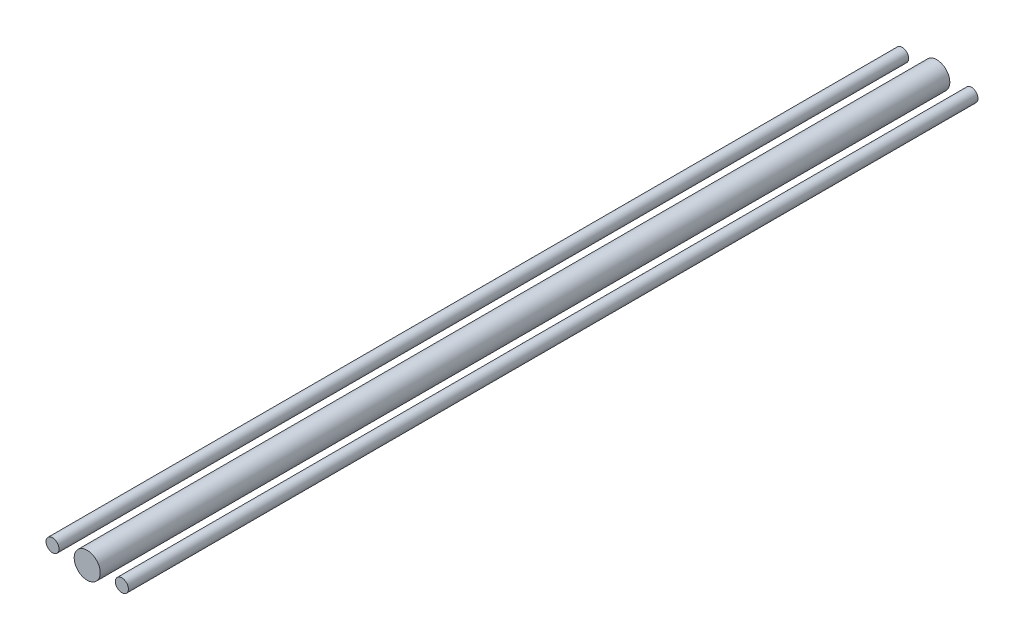
ISO-10303-21;
HEADER;
FILE_DESCRIPTION(('STEP AP214'),'2;1');
FILE_NAME('part.step','',(''),(''),'','','');
FILE_SCHEMA(('AUTOMOTIVE_DESIGN { 1 0 10303 214 1 1 1 1 }'));
ENDSEC;
DATA;
#1=APPLICATION_CONTEXT('core data for automotive mechanical design processes');
#2=APPLICATION_PROTOCOL_DEFINITION('international standard','automotive_design',2000,#1);
#3=PRODUCT_CONTEXT('',#1,'mechanical');
#4=PRODUCT('Part','Part','',(#3));
#5=PRODUCT_RELATED_PRODUCT_CATEGORY('part','',(#4));
#6=PRODUCT_DEFINITION_FORMATION('','',#4);
#7=PRODUCT_DEFINITION_CONTEXT('part definition',#1,'design');
#8=PRODUCT_DEFINITION('design','',#6,#7);
#9=PRODUCT_DEFINITION_SHAPE('','',#8);
#10=(LENGTH_UNIT() NAMED_UNIT(*) SI_UNIT(.MILLI.,.METRE.));
#11=(NAMED_UNIT(*) PLANE_ANGLE_UNIT() SI_UNIT($,.RADIAN.));
#12=(NAMED_UNIT(*) SI_UNIT($,.STERADIAN.) SOLID_ANGLE_UNIT());
#13=UNCERTAINTY_MEASURE_WITH_UNIT(LENGTH_MEASURE(1.E-05),#10,'distance_accuracy_value','');
#14=(GEOMETRIC_REPRESENTATION_CONTEXT(3) GLOBAL_UNCERTAINTY_ASSIGNED_CONTEXT((#13)) GLOBAL_UNIT_ASSIGNED_CONTEXT((#10,
#11,#12)) REPRESENTATION_CONTEXT('',''));
#15=CARTESIAN_POINT('',(0.,0.,0.));
#16=DIRECTION('',(0.,0.,1.));
#17=DIRECTION('',(1.,0.,0.));
#18=AXIS2_PLACEMENT_3D('',#15,#16,#17);
#19=CARTESIAN_POINT('',(-40.,0.,1000.));
#20=DIRECTION('',(0.,0.,-1.));
#21=DIRECTION('',(-1.,0.,0.));
#22=AXIS2_PLACEMENT_3D('',#19,#20,#21);
#23=CYLINDRICAL_SURFACE('',#22,7.5);
#24=CARTESIAN_POINT('',(-40.,0.,19.9999999999999));
#25=DIRECTION('',(0.,0.,1.));
#26=DIRECTION('',(1.,0.,0.));
#27=AXIS2_PLACEMENT_3D('',#24,#25,#26);
#28=CIRCLE('',#27,7.5);
#29=CARTESIAN_POINT('',(-32.5,0.,19.9999999999999));
#30=VERTEX_POINT('',#29);
#31=EDGE_CURVE('E51',#30,#30,#28,.F.);
#32=ORIENTED_EDGE('',*,*,#31,.F.);
#33=EDGE_LOOP('',(#32));
#34=FACE_BOUND('',#33,.T.);
#35=CARTESIAN_POINT('',(-40.,0.,1000.));
#36=DIRECTION('',(0.,0.,-1.));
#37=DIRECTION('',(-1.,0.,0.));
#38=AXIS2_PLACEMENT_3D('',#35,#36,#37);
#39=CIRCLE('',#38,7.5);
#40=CARTESIAN_POINT('',(-47.5,0.,1000.));
#41=VERTEX_POINT('',#40);
#42=EDGE_CURVE('E11',#41,#41,#39,.T.);
#43=ORIENTED_EDGE('',*,*,#42,.T.);
#44=EDGE_LOOP('',(#43));
#45=FACE_BOUND('',#44,.T.);
#46=ADVANCED_FACE('F47',(#34,#45),#23,.T.);
#47=CARTESIAN_POINT('',(-40.,0.,1000.));
#48=DIRECTION('',(0.,0.,-1.));
#49=DIRECTION('',(-1.,0.,0.));
#50=AXIS2_PLACEMENT_3D('',#47,#48,#49);
#51=PLANE('',#50);
#52=ORIENTED_EDGE('',*,*,#42,.F.);
#53=EDGE_LOOP('',(#52));
#54=FACE_BOUND('',#53,.T.);
#55=ADVANCED_FACE('F49',(#54),#51,.F.);
#56=CARTESIAN_POINT('',(47.5000000000004,0.,19.9999999999999));
#57=DIRECTION('',(0.,0.,1.));
#58=DIRECTION('',(1.,0.,0.));
#59=AXIS2_PLACEMENT_3D('',#56,#57,#58);
#60=PLANE('',#59);
#61=ORIENTED_EDGE('',*,*,#31,.T.);
#62=EDGE_LOOP('',(#61));
#63=FACE_BOUND('',#62,.T.);
#64=ADVANCED_FACE('F60',(#63),#60,.F.);
#65=CLOSED_SHELL('',(#46,#55,#64));
#66=MANIFOLD_SOLID_BREP('B2',#65);
#67=CARTESIAN_POINT('',(40.,0.,1000.));
#68=DIRECTION('',(0.,0.,-1.));
#69=DIRECTION('',(-1.,0.,0.));
#70=AXIS2_PLACEMENT_3D('',#67,#68,#69);
#71=CYLINDRICAL_SURFACE('',#70,7.5);
#72=CARTESIAN_POINT('',(40.,0.,19.9999999999999));
#73=DIRECTION('',(0.,0.,1.));
#74=DIRECTION('',(1.,0.,0.));
#75=AXIS2_PLACEMENT_3D('',#72,#73,#74);
#76=CIRCLE('',#75,7.5);
#77=CARTESIAN_POINT('',(47.5,0.,19.9999999999999));
#78=VERTEX_POINT('',#77);
#79=EDGE_CURVE('E106',#78,#78,#76,.F.);
#80=ORIENTED_EDGE('',*,*,#79,.F.);
#81=EDGE_LOOP('',(#80));
#82=FACE_BOUND('',#81,.T.);
#83=CARTESIAN_POINT('',(40.,0.,1000.));
#84=DIRECTION('',(0.,0.,-1.));
#85=DIRECTION('',(-1.,0.,0.));
#86=AXIS2_PLACEMENT_3D('',#83,#84,#85);
#87=CIRCLE('',#86,7.5);
#88=CARTESIAN_POINT('',(32.5,0.,1000.));
#89=VERTEX_POINT('',#88);
#90=EDGE_CURVE('E46',#89,#89,#87,.T.);
#91=ORIENTED_EDGE('',*,*,#90,.T.);
#92=EDGE_LOOP('',(#91));
#93=FACE_BOUND('',#92,.T.);
#94=ADVANCED_FACE('F103',(#82,#93),#71,.T.);
#95=CARTESIAN_POINT('',(40.,0.,1000.));
#96=DIRECTION('',(0.,0.,-1.));
#97=DIRECTION('',(-1.,0.,0.));
#98=AXIS2_PLACEMENT_3D('',#95,#96,#97);
#99=PLANE('',#98);
#100=ORIENTED_EDGE('',*,*,#90,.F.);
#101=EDGE_LOOP('',(#100));
#102=FACE_BOUND('',#101,.T.);
#103=ADVANCED_FACE('F118',(#102),#99,.F.);
#104=CARTESIAN_POINT('',(47.5000000000004,0.,19.9999999999999));
#105=DIRECTION('',(0.,0.,1.));
#106=DIRECTION('',(1.,0.,0.));
#107=AXIS2_PLACEMENT_3D('',#104,#105,#106);
#108=PLANE('',#107);
#109=ORIENTED_EDGE('',*,*,#79,.T.);
#110=EDGE_LOOP('',(#109));
#111=FACE_BOUND('',#110,.T.);
#112=ADVANCED_FACE('F115',(#111),#108,.F.);
#113=CLOSED_SHELL('',(#94,#103,#112));
#114=MANIFOLD_SOLID_BREP('B6',#113);
#115=CARTESIAN_POINT('',(0.,0.,1000.));
#116=DIRECTION('',(0.,0.,-1.));
#117=DIRECTION('',(-1.,0.,0.));
#118=AXIS2_PLACEMENT_3D('',#115,#116,#117);
#119=CYLINDRICAL_SURFACE('',#118,15.);
#120=CARTESIAN_POINT('',(0.,0.,19.9999999999999));
#121=DIRECTION('',(0.,0.,1.));
#122=DIRECTION('',(1.,0.,0.));
#123=AXIS2_PLACEMENT_3D('',#120,#121,#122);
#124=CIRCLE('',#123,15.);
#125=CARTESIAN_POINT('',(15.,0.,19.9999999999999));
#126=VERTEX_POINT('',#125);
#127=EDGE_CURVE('E155',#126,#126,#124,.T.);
#128=ORIENTED_EDGE('',*,*,#127,.T.);
#129=EDGE_LOOP('',(#128));
#130=FACE_BOUND('',#129,.T.);
#131=CARTESIAN_POINT('',(0.,0.,1000.));
#132=DIRECTION('',(0.,0.,1.));
#133=DIRECTION('',(1.,0.,0.));
#134=AXIS2_PLACEMENT_3D('',#131,#132,#133);
#135=CIRCLE('',#134,15.);
#136=CARTESIAN_POINT('',(15.,0.,1000.));
#137=VERTEX_POINT('',#136);
#138=EDGE_CURVE('E102',#137,#137,#135,.T.);
#139=ORIENTED_EDGE('',*,*,#138,.F.);
#140=EDGE_LOOP('',(#139));
#141=FACE_BOUND('',#140,.T.);
#142=ADVANCED_FACE('F152',(#130,#141),#119,.T.);
#143=CARTESIAN_POINT('',(0.,0.,1000.));
#144=DIRECTION('',(0.,0.,1.));
#145=DIRECTION('',(1.,0.,0.));
#146=AXIS2_PLACEMENT_3D('',#143,#144,#145);
#147=PLANE('',#146);
#148=ORIENTED_EDGE('',*,*,#138,.T.);
#149=EDGE_LOOP('',(#148));
#150=FACE_BOUND('',#149,.T.);
#151=ADVANCED_FACE('F168',(#150),#147,.T.);
#152=CARTESIAN_POINT('',(47.5000000000004,0.,19.9999999999999));
#153=DIRECTION('',(0.,0.,1.));
#154=DIRECTION('',(1.,0.,0.));
#155=AXIS2_PLACEMENT_3D('',#152,#153,#154);
#156=PLANE('',#155);
#157=ORIENTED_EDGE('',*,*,#127,.F.);
#158=EDGE_LOOP('',(#157));
#159=FACE_BOUND('',#158,.T.);
#160=ADVANCED_FACE('F166',(#159),#156,.F.);
#161=CLOSED_SHELL('',(#142,#151,#160));
#162=MANIFOLD_SOLID_BREP('B41',#161);
#163=ADVANCED_BREP_SHAPE_REPRESENTATION('',(#18,#66,#114,#162),#14);
#164=SHAPE_DEFINITION_REPRESENTATION(#9,#163);
ENDSEC;
END-ISO-10303-21;
